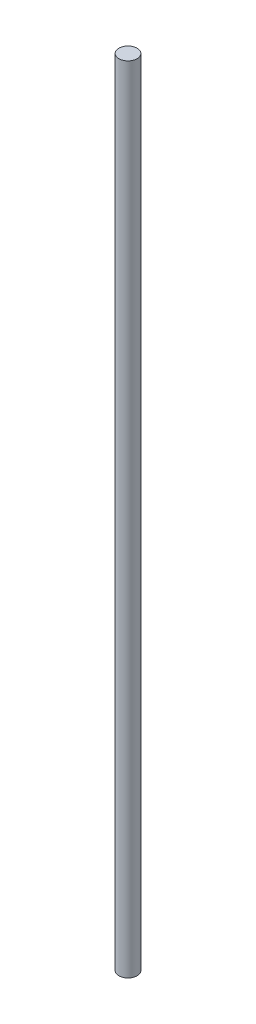
ISO-10303-21;
HEADER;
FILE_DESCRIPTION(('STEP AP214'),'2;1');
FILE_NAME('part.step','',(''),(''),'','','');
FILE_SCHEMA(('AUTOMOTIVE_DESIGN { 1 0 10303 214 1 1 1 1 }'));
ENDSEC;
DATA;
#1=APPLICATION_CONTEXT('core data for automotive mechanical design processes');
#2=APPLICATION_PROTOCOL_DEFINITION('international standard','automotive_design',2000,#1);
#3=PRODUCT_CONTEXT('',#1,'mechanical');
#4=PRODUCT('Part','Part','',(#3));
#5=PRODUCT_RELATED_PRODUCT_CATEGORY('part','',(#4));
#6=PRODUCT_DEFINITION_FORMATION('','',#4);
#7=PRODUCT_DEFINITION_CONTEXT('part definition',#1,'design');
#8=PRODUCT_DEFINITION('design','',#6,#7);
#9=PRODUCT_DEFINITION_SHAPE('','',#8);
#10=(LENGTH_UNIT() NAMED_UNIT(*) SI_UNIT(.MILLI.,.METRE.));
#11=(NAMED_UNIT(*) PLANE_ANGLE_UNIT() SI_UNIT($,.RADIAN.));
#12=(NAMED_UNIT(*) SI_UNIT($,.STERADIAN.) SOLID_ANGLE_UNIT());
#13=UNCERTAINTY_MEASURE_WITH_UNIT(LENGTH_MEASURE(1.E-05),#10,'distance_accuracy_value','');
#14=(GEOMETRIC_REPRESENTATION_CONTEXT(3) GLOBAL_UNCERTAINTY_ASSIGNED_CONTEXT((#13)) GLOBAL_UNIT_ASSIGNED_CONTEXT((#10,
#11,#12)) REPRESENTATION_CONTEXT('',''));
#15=CARTESIAN_POINT('',(0.,0.,0.));
#16=DIRECTION('',(0.,0.,1.));
#17=DIRECTION('',(1.,0.,0.));
#18=AXIS2_PLACEMENT_3D('',#15,#16,#17);
#19=CARTESIAN_POINT('',(0.,523.,0.));
#20=DIRECTION('',(0.,-1.,0.));
#21=DIRECTION('',(0.,0.,-1.));
#22=AXIS2_PLACEMENT_3D('',#19,#20,#21);
#23=CYLINDRICAL_SURFACE('',#22,6.);
#24=CARTESIAN_POINT('',(0.,523.,0.));
#25=DIRECTION('',(0.,1.,0.));
#26=DIRECTION('',(0.,0.,1.));
#27=AXIS2_PLACEMENT_3D('',#24,#25,#26);
#28=CIRCLE('',#27,6.);
#29=CARTESIAN_POINT('',(0.,523.,6.));
#30=VERTEX_POINT('',#29);
#31=EDGE_CURVE('E10',#30,#30,#28,.T.);
#32=ORIENTED_EDGE('',*,*,#31,.F.);
#33=EDGE_LOOP('',(#32));
#34=FACE_BOUND('',#33,.T.);
#35=CARTESIAN_POINT('',(0.,0.,0.));
#36=DIRECTION('',(0.,1.,0.));
#37=DIRECTION('',(0.,0.,1.));
#38=AXIS2_PLACEMENT_3D('',#35,#36,#37);
#39=CIRCLE('',#38,6.);
#40=CARTESIAN_POINT('',(0.,0.,6.));
#41=VERTEX_POINT('',#40);
#42=EDGE_CURVE('E37',#41,#41,#39,.T.);
#43=ORIENTED_EDGE('',*,*,#42,.T.);
#44=EDGE_LOOP('',(#43));
#45=FACE_BOUND('',#44,.T.);
#46=ADVANCED_FACE('F34',(#34,#45),#23,.T.);
#47=CARTESIAN_POINT('',(0.,523.,0.));
#48=DIRECTION('',(0.,1.,0.));
#49=DIRECTION('',(0.,0.,1.));
#50=AXIS2_PLACEMENT_3D('',#47,#48,#49);
#51=PLANE('',#50);
#52=ORIENTED_EDGE('',*,*,#31,.T.);
#53=EDGE_LOOP('',(#52));
#54=FACE_BOUND('',#53,.T.);
#55=ADVANCED_FACE('F50',(#54),#51,.T.);
#56=CARTESIAN_POINT('',(0.,0.,0.));
#57=DIRECTION('',(0.,1.,0.));
#58=DIRECTION('',(0.,0.,1.));
#59=AXIS2_PLACEMENT_3D('',#56,#57,#58);
#60=PLANE('',#59);
#61=ORIENTED_EDGE('',*,*,#42,.F.);
#62=EDGE_LOOP('',(#61));
#63=FACE_BOUND('',#62,.T.);
#64=ADVANCED_FACE('F48',(#63),#60,.F.);
#65=CLOSED_SHELL('',(#46,#55,#64));
#66=MANIFOLD_SOLID_BREP('B2',#65);
#67=ADVANCED_BREP_SHAPE_REPRESENTATION('',(#18,#66),#14);
#68=SHAPE_DEFINITION_REPRESENTATION(#9,#67);
ENDSEC;
END-ISO-10303-21;
